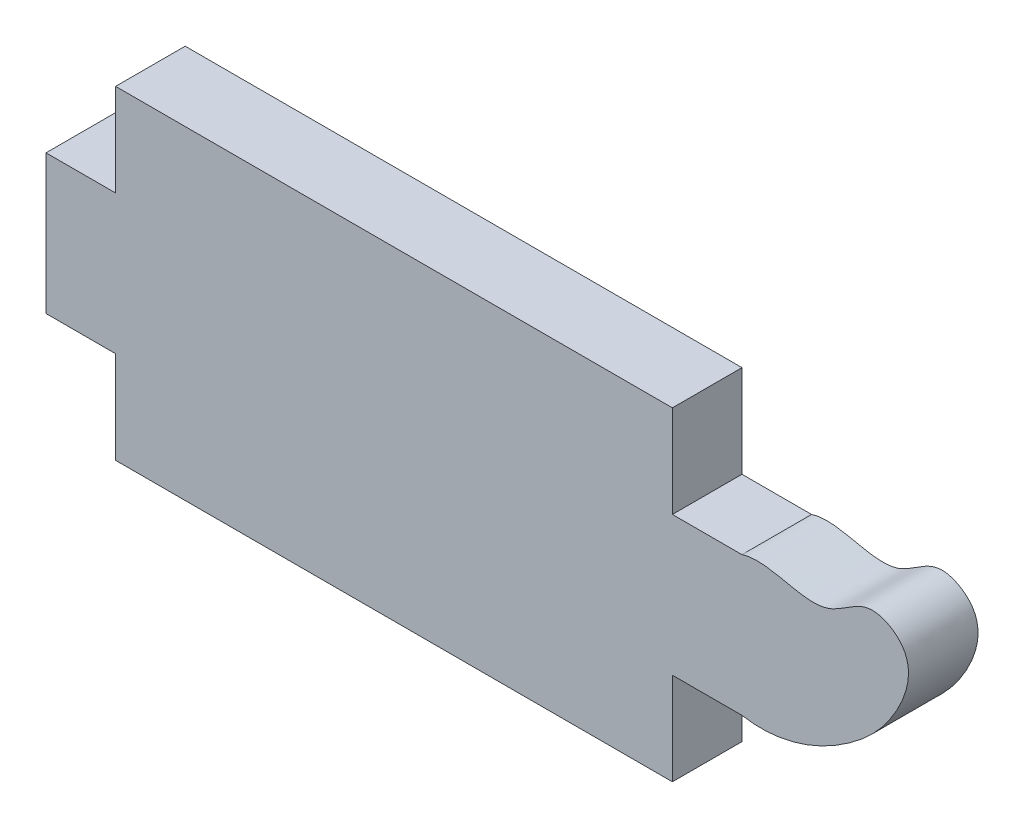
ISO-10303-21;
HEADER;
FILE_DESCRIPTION(('STEP AP214'),'2;1');
FILE_NAME('part.step','',(''),(''),'','','');
FILE_SCHEMA(('AUTOMOTIVE_DESIGN { 1 0 10303 214 1 1 1 1 }'));
ENDSEC;
DATA;
#1=APPLICATION_CONTEXT('core data for automotive mechanical design processes');
#2=APPLICATION_PROTOCOL_DEFINITION('international standard','automotive_design',2000,#1);
#3=PRODUCT_CONTEXT('',#1,'mechanical');
#4=PRODUCT('Part','Part','',(#3));
#5=PRODUCT_RELATED_PRODUCT_CATEGORY('part','',(#4));
#6=PRODUCT_DEFINITION_FORMATION('','',#4);
#7=PRODUCT_DEFINITION_CONTEXT('part definition',#1,'design');
#8=PRODUCT_DEFINITION('design','',#6,#7);
#9=PRODUCT_DEFINITION_SHAPE('','',#8);
#10=(LENGTH_UNIT() NAMED_UNIT(*) SI_UNIT(.MILLI.,.METRE.));
#11=(NAMED_UNIT(*) PLANE_ANGLE_UNIT() SI_UNIT($,.RADIAN.));
#12=(NAMED_UNIT(*) SI_UNIT($,.STERADIAN.) SOLID_ANGLE_UNIT());
#13=UNCERTAINTY_MEASURE_WITH_UNIT(LENGTH_MEASURE(1.E-05),#10,'distance_accuracy_value','');
#14=(GEOMETRIC_REPRESENTATION_CONTEXT(3) GLOBAL_UNCERTAINTY_ASSIGNED_CONTEXT((#13)) GLOBAL_UNIT_ASSIGNED_CONTEXT((#10,
#11,#12)) REPRESENTATION_CONTEXT('',''));
#15=CARTESIAN_POINT('',(0.,0.,0.));
#16=DIRECTION('',(0.,0.,1.));
#17=DIRECTION('',(1.,0.,0.));
#18=AXIS2_PLACEMENT_3D('',#15,#16,#17);
#19=CARTESIAN_POINT('',(0.,48.0131422529701,-3.175));
#20=DIRECTION('',(-1.,0.,0.));
#21=DIRECTION('',(0.,-1.,0.));
#22=AXIS2_PLACEMENT_3D('',#19,#20,#21);
#23=PLANE('',#22);
#24=DIRECTION('',(0.,-1.,0.));
#25=VECTOR('',#24,1.);
#26=CARTESIAN_POINT('',(0.,48.0131422529701,0.));
#27=LINE('',#26,#25);
#28=CARTESIAN_POINT('',(0.,48.0131422529701,0.));
#29=VERTEX_POINT('',#28);
#30=CARTESIAN_POINT('',(0.,43.8003814965513,0.));
#31=VERTEX_POINT('',#30);
#32=EDGE_CURVE('E153',#29,#31,#27,.T.);
#33=ORIENTED_EDGE('',*,*,#32,.T.);
#34=DIRECTION('',(0.,0.,1.));
#35=VECTOR('',#34,1.);
#36=CARTESIAN_POINT('',(0.,43.8003814965513,-3.175));
#37=LINE('',#36,#35);
#38=CARTESIAN_POINT('',(0.,43.8003814965513,-3.175));
#39=VERTEX_POINT('',#38);
#40=EDGE_CURVE('E11',#39,#31,#37,.T.);
#41=ORIENTED_EDGE('',*,*,#40,.F.);
#42=DIRECTION('',(0.,-1.,0.));
#43=VECTOR('',#42,1.);
#44=CARTESIAN_POINT('',(0.,48.0131422529701,-3.175));
#45=LINE('',#44,#43);
#46=CARTESIAN_POINT('',(0.,48.0131422529701,-3.175));
#47=VERTEX_POINT('',#46);
#48=EDGE_CURVE('E98',#47,#39,#45,.T.);
#49=ORIENTED_EDGE('',*,*,#48,.F.);
#50=DIRECTION('',(0.,0.,1.));
#51=VECTOR('',#50,1.);
#52=CARTESIAN_POINT('',(0.,48.0131422529701,-3.175));
#53=LINE('',#52,#51);
#54=EDGE_CURVE('E49',#47,#29,#53,.T.);
#55=ORIENTED_EDGE('',*,*,#54,.T.);
#56=EDGE_LOOP('',(#33,#41,#49,#55));
#57=FACE_BOUND('',#56,.T.);
#58=ADVANCED_FACE('F33',(#57),#23,.F.);
#59=CARTESIAN_POINT('',(3.175,43.8003814965513,-3.175));
#60=DIRECTION('',(0.,1.,0.));
#61=DIRECTION('',(0.,0.,1.));
#62=AXIS2_PLACEMENT_3D('',#59,#60,#61);
#63=PLANE('',#62);
#64=DIRECTION('',(-1.,0.,0.));
#65=VECTOR('',#64,1.);
#66=CARTESIAN_POINT('',(3.175,43.8003814965513,0.));
#67=LINE('',#66,#65);
#68=CARTESIAN_POINT('',(3.175,43.8003814965513,0.));
#69=VERTEX_POINT('',#68);
#70=EDGE_CURVE('E155',#69,#31,#67,.T.);
#71=ORIENTED_EDGE('',*,*,#70,.F.);
#72=DIRECTION('',(0.,0.,1.));
#73=VECTOR('',#72,1.);
#74=CARTESIAN_POINT('',(3.175,43.8003814965513,-3.175));
#75=LINE('',#74,#73);
#76=CARTESIAN_POINT('',(3.175,43.8003814965513,-3.175));
#77=VERTEX_POINT('',#76);
#78=EDGE_CURVE('E41',#77,#69,#75,.T.);
#79=ORIENTED_EDGE('',*,*,#78,.F.);
#80=DIRECTION('',(-1.,0.,0.));
#81=VECTOR('',#80,1.);
#82=CARTESIAN_POINT('',(3.175,43.8003814965513,-3.175));
#83=LINE('',#82,#81);
#84=EDGE_CURVE('E227',#77,#39,#83,.T.);
#85=ORIENTED_EDGE('',*,*,#84,.T.);
#86=ORIENTED_EDGE('',*,*,#40,.T.);
#87=EDGE_LOOP('',(#71,#79,#85,#86));
#88=FACE_BOUND('',#87,.T.);
#89=ADVANCED_FACE('F212',(#88),#63,.T.);
#90=CARTESIAN_POINT('',(3.175,37.4503814965513,-3.175));
#91=CARTESIAN_POINT('',(5.02206388862919,37.1184558025095,-3.175));
#92=CARTESIAN_POINT('',(7.75151141607924,38.2602554304477,-3.175));
#93=CARTESIAN_POINT('',(10.2327629725713,40.7568330619822,-3.175));
#94=CARTESIAN_POINT('',(11.3200461760138,43.626059772161,-3.175));
#95=CARTESIAN_POINT('',(8.82372759272067,45.0463901926915,-3.175));
#96=CARTESIAN_POINT('',(6.7278942310241,42.6783956586535,-3.175));
#97=CARTESIAN_POINT('',(4.43155314018471,44.2179384868482,-3.175));
#98=CARTESIAN_POINT('',(3.175,43.8003814965513,-3.175));
#99=B_SPLINE_CURVE_WITH_KNOTS('',3,(#90,#91,#92,#93,#94,#95,#96,#97,#98),.UNSPECIFIED.,.F.,.F.,
(4,1,1,1,1,1,4),(0.,0.293580813989756,0.427451977786502,0.586796469482608,0.673694467473646,
0.788354379045849,1.),.UNSPECIFIED.);
#100=DIRECTION('',(0.,0.,1.));
#101=VECTOR('',#100,1.);
#102=SURFACE_OF_LINEAR_EXTRUSION('',#99,#101);
#103=CARTESIAN_POINT('',(3.175,37.4503814965513,0.));
#104=CARTESIAN_POINT('',(5.02206388862919,37.1184558025095,0.));
#105=CARTESIAN_POINT('',(7.75151141607924,38.2602554304477,0.));
#106=CARTESIAN_POINT('',(10.2327629725713,40.7568330619822,0.));
#107=CARTESIAN_POINT('',(11.3200461760138,43.626059772161,0.));
#108=CARTESIAN_POINT('',(8.82372759272067,45.0463901926915,0.));
#109=CARTESIAN_POINT('',(6.7278942310241,42.6783956586535,0.));
#110=CARTESIAN_POINT('',(4.43155314018471,44.2179384868482,0.));
#111=CARTESIAN_POINT('',(3.175,43.8003814965513,0.));
#112=B_SPLINE_CURVE_WITH_KNOTS('',3,(#103,#104,#105,#106,#107,#108,#109,#110,#111),
.UNSPECIFIED.,.F.,.F.,(4,1,1,1,1,1,4),(0.,0.293580813989756,0.427451977786502,0.586796469482608,
0.673694467473646,0.788354379045849,1.),.UNSPECIFIED.);
#113=CARTESIAN_POINT('',(3.175,37.4503814965513,0.));
#114=VERTEX_POINT('',#113);
#115=EDGE_CURVE('E158',#114,#69,#112,.T.);
#116=ORIENTED_EDGE('',*,*,#115,.F.);
#117=DIRECTION('',(0.,0.,1.));
#118=VECTOR('',#117,1.);
#119=CARTESIAN_POINT('',(3.175,37.4503814965513,-3.175));
#120=LINE('',#119,#118);
#121=CARTESIAN_POINT('',(3.175,37.4503814965513,-3.175));
#122=VERTEX_POINT('',#121);
#123=EDGE_CURVE('E202',#122,#114,#120,.T.);
#124=ORIENTED_EDGE('',*,*,#123,.F.);
#125=EDGE_CURVE('E209',#122,#77,#99,.T.);
#126=ORIENTED_EDGE('',*,*,#125,.T.);
#127=ORIENTED_EDGE('',*,*,#78,.T.);
#128=EDGE_LOOP('',(#116,#124,#126,#127));
#129=FACE_BOUND('',#128,.T.);
#130=ADVANCED_FACE('F207',(#129),#102,.T.);
#131=CARTESIAN_POINT('',(3.175,37.4503814965513,-3.175));
#132=DIRECTION('',(0.,1.,0.));
#133=DIRECTION('',(0.,0.,1.));
#134=AXIS2_PLACEMENT_3D('',#131,#132,#133);
#135=PLANE('',#134);
#136=DIRECTION('',(-1.,0.,0.));
#137=VECTOR('',#136,1.);
#138=CARTESIAN_POINT('',(3.175,37.4503814965513,0.));
#139=LINE('',#138,#137);
#140=CARTESIAN_POINT('',(0.,37.4503814965513,0.));
#141=VERTEX_POINT('',#140);
#142=EDGE_CURVE('E163',#114,#141,#139,.T.);
#143=ORIENTED_EDGE('',*,*,#142,.T.);
#144=DIRECTION('',(0.,0.,1.));
#145=VECTOR('',#144,1.);
#146=CARTESIAN_POINT('',(0.,37.4503814965513,-3.175));
#147=LINE('',#146,#145);
#148=CARTESIAN_POINT('',(0.,37.4503814965513,-3.175));
#149=VERTEX_POINT('',#148);
#150=EDGE_CURVE('E200',#149,#141,#147,.T.);
#151=ORIENTED_EDGE('',*,*,#150,.F.);
#152=DIRECTION('',(-1.,0.,0.));
#153=VECTOR('',#152,1.);
#154=CARTESIAN_POINT('',(3.175,37.4503814965513,-3.175));
#155=LINE('',#154,#153);
#156=EDGE_CURVE('E223',#122,#149,#155,.T.);
#157=ORIENTED_EDGE('',*,*,#156,.F.);
#158=ORIENTED_EDGE('',*,*,#123,.T.);
#159=EDGE_LOOP('',(#143,#151,#157,#158));
#160=FACE_BOUND('',#159,.T.);
#161=ADVANCED_FACE('F220',(#160),#135,.F.);
#162=CARTESIAN_POINT('',(0.,33.2376207401325,-3.175));
#163=DIRECTION('',(1.,0.,0.));
#164=DIRECTION('',(0.,1.,0.));
#165=AXIS2_PLACEMENT_3D('',#162,#163,#164);
#166=PLANE('',#165);
#167=DIRECTION('',(0.,1.,0.));
#168=VECTOR('',#167,1.);
#169=CARTESIAN_POINT('',(0.,33.2376207401325,0.));
#170=LINE('',#169,#168);
#171=CARTESIAN_POINT('',(0.,33.2376207401325,0.));
#172=VERTEX_POINT('',#171);
#173=EDGE_CURVE('E169',#172,#141,#170,.T.);
#174=ORIENTED_EDGE('',*,*,#173,.F.);
#175=DIRECTION('',(0.,0.,1.));
#176=VECTOR('',#175,1.);
#177=CARTESIAN_POINT('',(0.,33.2376207401325,-3.175));
#178=LINE('',#177,#176);
#179=CARTESIAN_POINT('',(0.,33.2376207401325,-3.175));
#180=VERTEX_POINT('',#179);
#181=EDGE_CURVE('E198',#180,#172,#178,.T.);
#182=ORIENTED_EDGE('',*,*,#181,.F.);
#183=DIRECTION('',(0.,1.,0.));
#184=VECTOR('',#183,1.);
#185=CARTESIAN_POINT('',(0.,33.2376207401325,-3.175));
#186=LINE('',#185,#184);
#187=EDGE_CURVE('E225',#180,#149,#186,.T.);
#188=ORIENTED_EDGE('',*,*,#187,.T.);
#189=ORIENTED_EDGE('',*,*,#150,.T.);
#190=EDGE_LOOP('',(#174,#182,#188,#189));
#191=FACE_BOUND('',#190,.T.);
#192=ADVANCED_FACE('F275',(#191),#166,.T.);
#193=CARTESIAN_POINT('',(0.,33.2376207401325,-3.175));
#194=DIRECTION('',(0.,1.,0.));
#195=DIRECTION('',(0.,0.,1.));
#196=AXIS2_PLACEMENT_3D('',#193,#194,#195);
#197=PLANE('',#196);
#198=DIRECTION('',(-1.,0.,0.));
#199=VECTOR('',#198,1.);
#200=CARTESIAN_POINT('',(0.,33.2376207401325,0.));
#201=LINE('',#200,#199);
#202=CARTESIAN_POINT('',(-25.4,33.2376207401325,0.));
#203=VERTEX_POINT('',#202);
#204=EDGE_CURVE('E172',#172,#203,#201,.T.);
#205=ORIENTED_EDGE('',*,*,#204,.T.);
#206=DIRECTION('',(0.,0.,1.));
#207=VECTOR('',#206,1.);
#208=CARTESIAN_POINT('',(-25.4,33.2376207401325,-3.175));
#209=LINE('',#208,#207);
#210=CARTESIAN_POINT('',(-25.4,33.2376207401325,-3.175));
#211=VERTEX_POINT('',#210);
#212=EDGE_CURVE('E195',#211,#203,#209,.T.);
#213=ORIENTED_EDGE('',*,*,#212,.F.);
#214=DIRECTION('',(-1.,0.,0.));
#215=VECTOR('',#214,1.);
#216=CARTESIAN_POINT('',(0.,33.2376207401325,-3.175));
#217=LINE('',#216,#215);
#218=EDGE_CURVE('E283',#180,#211,#217,.T.);
#219=ORIENTED_EDGE('',*,*,#218,.F.);
#220=ORIENTED_EDGE('',*,*,#181,.T.);
#221=EDGE_LOOP('',(#205,#213,#219,#220));
#222=FACE_BOUND('',#221,.T.);
#223=ADVANCED_FACE('F272',(#222),#197,.F.);
#224=CARTESIAN_POINT('',(-25.4,33.2376207401325,-3.175));
#225=DIRECTION('',(1.,0.,0.));
#226=DIRECTION('',(0.,0.,-1.));
#227=AXIS2_PLACEMENT_3D('',#224,#225,#226);
#228=PLANE('',#227);
#229=DIRECTION('',(0.,1.,0.));
#230=VECTOR('',#229,1.);
#231=CARTESIAN_POINT('',(-25.4,33.2376207401325,0.));
#232=LINE('',#231,#230);
#233=CARTESIAN_POINT('',(-25.4,37.4503814965513,0.));
#234=VERTEX_POINT('',#233);
#235=EDGE_CURVE('E174',#203,#234,#232,.T.);
#236=ORIENTED_EDGE('',*,*,#235,.T.);
#237=DIRECTION('',(0.,0.,1.));
#238=VECTOR('',#237,1.);
#239=CARTESIAN_POINT('',(-25.4,37.4503814965513,-3.175));
#240=LINE('',#239,#238);
#241=CARTESIAN_POINT('',(-25.4,37.4503814965513,-3.175));
#242=VERTEX_POINT('',#241);
#243=EDGE_CURVE('E193',#242,#234,#240,.T.);
#244=ORIENTED_EDGE('',*,*,#243,.F.);
#245=DIRECTION('',(0.,1.,0.));
#246=VECTOR('',#245,1.);
#247=CARTESIAN_POINT('',(-25.4,33.2376207401325,-3.175));
#248=LINE('',#247,#246);
#249=EDGE_CURVE('E284',#211,#242,#248,.T.);
#250=ORIENTED_EDGE('',*,*,#249,.F.);
#251=ORIENTED_EDGE('',*,*,#212,.T.);
#252=EDGE_LOOP('',(#236,#244,#250,#251));
#253=FACE_BOUND('',#252,.T.);
#254=ADVANCED_FACE('F268',(#253),#228,.F.);
#255=CARTESIAN_POINT('',(-28.575,37.4503814965513,-3.175));
#256=DIRECTION('',(0.,-1.,0.));
#257=DIRECTION('',(0.,0.,-1.));
#258=AXIS2_PLACEMENT_3D('',#255,#256,#257);
#259=PLANE('',#258);
#260=DIRECTION('',(1.,0.,0.));
#261=VECTOR('',#260,1.);
#262=CARTESIAN_POINT('',(-28.575,37.4503814965513,0.));
#263=LINE('',#262,#261);
#264=CARTESIAN_POINT('',(-28.575,37.4503814965513,0.));
#265=VERTEX_POINT('',#264);
#266=EDGE_CURVE('E177',#265,#234,#263,.T.);
#267=ORIENTED_EDGE('',*,*,#266,.F.);
#268=DIRECTION('',(0.,0.,1.));
#269=VECTOR('',#268,1.);
#270=CARTESIAN_POINT('',(-28.575,37.4503814965513,-3.175));
#271=LINE('',#270,#269);
#272=CARTESIAN_POINT('',(-28.575,37.4503814965513,-3.175));
#273=VERTEX_POINT('',#272);
#274=EDGE_CURVE('E191',#273,#265,#271,.T.);
#275=ORIENTED_EDGE('',*,*,#274,.F.);
#276=DIRECTION('',(1.,0.,0.));
#277=VECTOR('',#276,1.);
#278=CARTESIAN_POINT('',(-28.575,37.4503814965513,-3.175));
#279=LINE('',#278,#277);
#280=EDGE_CURVE('E288',#273,#242,#279,.T.);
#281=ORIENTED_EDGE('',*,*,#280,.T.);
#282=ORIENTED_EDGE('',*,*,#243,.T.);
#283=EDGE_LOOP('',(#267,#275,#281,#282));
#284=FACE_BOUND('',#283,.T.);
#285=ADVANCED_FACE('F264',(#284),#259,.T.);
#286=CARTESIAN_POINT('',(-28.575,37.4503814965513,-3.175));
#287=DIRECTION('',(1.,0.,0.));
#288=DIRECTION('',(0.,1.,0.));
#289=AXIS2_PLACEMENT_3D('',#286,#287,#288);
#290=PLANE('',#289);
#291=DIRECTION('',(0.,1.,0.));
#292=VECTOR('',#291,1.);
#293=CARTESIAN_POINT('',(-28.575,37.4503814965513,0.));
#294=LINE('',#293,#292);
#295=CARTESIAN_POINT('',(-28.575,43.8003814965513,0.));
#296=VERTEX_POINT('',#295);
#297=EDGE_CURVE('E180',#265,#296,#294,.T.);
#298=ORIENTED_EDGE('',*,*,#297,.T.);
#299=DIRECTION('',(0.,0.,1.));
#300=VECTOR('',#299,1.);
#301=CARTESIAN_POINT('',(-28.575,43.8003814965513,-3.175));
#302=LINE('',#301,#300);
#303=CARTESIAN_POINT('',(-28.575,43.8003814965513,-3.175));
#304=VERTEX_POINT('',#303);
#305=EDGE_CURVE('E145',#304,#296,#302,.T.);
#306=ORIENTED_EDGE('',*,*,#305,.F.);
#307=DIRECTION('',(0.,1.,0.));
#308=VECTOR('',#307,1.);
#309=CARTESIAN_POINT('',(-28.575,37.4503814965513,-3.175));
#310=LINE('',#309,#308);
#311=EDGE_CURVE('E133',#273,#304,#310,.T.);
#312=ORIENTED_EDGE('',*,*,#311,.F.);
#313=ORIENTED_EDGE('',*,*,#274,.T.);
#314=EDGE_LOOP('',(#298,#306,#312,#313));
#315=FACE_BOUND('',#314,.T.);
#316=ADVANCED_FACE('F261',(#315),#290,.F.);
#317=CARTESIAN_POINT('',(-28.575,43.8003814965513,-3.175));
#318=DIRECTION('',(0.,-1.,0.));
#319=DIRECTION('',(0.,0.,-1.));
#320=AXIS2_PLACEMENT_3D('',#317,#318,#319);
#321=PLANE('',#320);
#322=DIRECTION('',(1.,0.,0.));
#323=VECTOR('',#322,1.);
#324=CARTESIAN_POINT('',(-28.575,43.8003814965513,0.));
#325=LINE('',#324,#323);
#326=CARTESIAN_POINT('',(-25.4,43.8003814965513,0.));
#327=VERTEX_POINT('',#326);
#328=EDGE_CURVE('E142',#296,#327,#325,.T.);
#329=ORIENTED_EDGE('',*,*,#328,.T.);
#330=DIRECTION('',(0.,0.,1.));
#331=VECTOR('',#330,1.);
#332=CARTESIAN_POINT('',(-25.4,43.8003814965513,-3.175));
#333=LINE('',#332,#331);
#334=CARTESIAN_POINT('',(-25.4,43.8003814965513,-3.175));
#335=VERTEX_POINT('',#334);
#336=EDGE_CURVE('E139',#335,#327,#333,.T.);
#337=ORIENTED_EDGE('',*,*,#336,.F.);
#338=DIRECTION('',(1.,0.,0.));
#339=VECTOR('',#338,1.);
#340=CARTESIAN_POINT('',(-28.575,43.8003814965513,-3.175));
#341=LINE('',#340,#339);
#342=EDGE_CURVE('E126',#304,#335,#341,.T.);
#343=ORIENTED_EDGE('',*,*,#342,.F.);
#344=ORIENTED_EDGE('',*,*,#305,.T.);
#345=EDGE_LOOP('',(#329,#337,#343,#344));
#346=FACE_BOUND('',#345,.T.);
#347=ADVANCED_FACE('F140',(#346),#321,.F.);
#348=CARTESIAN_POINT('',(-25.4,48.0131422529701,-3.175));
#349=DIRECTION('',(-1.,0.,0.));
#350=DIRECTION('',(0.,-1.,0.));
#351=AXIS2_PLACEMENT_3D('',#348,#349,#350);
#352=PLANE('',#351);
#353=DIRECTION('',(0.,-1.,0.));
#354=VECTOR('',#353,1.);
#355=CARTESIAN_POINT('',(-25.4,48.0131422529701,0.));
#356=LINE('',#355,#354);
#357=CARTESIAN_POINT('',(-25.4,48.0131422529701,0.));
#358=VERTEX_POINT('',#357);
#359=EDGE_CURVE('E183',#358,#327,#356,.T.);
#360=ORIENTED_EDGE('',*,*,#359,.F.);
#361=DIRECTION('',(0.,0.,1.));
#362=VECTOR('',#361,1.);
#363=CARTESIAN_POINT('',(-25.4,48.0131422529701,-3.175));
#364=LINE('',#363,#362);
#365=CARTESIAN_POINT('',(-25.4,48.0131422529701,-3.175));
#366=VERTEX_POINT('',#365);
#367=EDGE_CURVE('E86',#366,#358,#364,.T.);
#368=ORIENTED_EDGE('',*,*,#367,.F.);
#369=DIRECTION('',(0.,-1.,0.));
#370=VECTOR('',#369,1.);
#371=CARTESIAN_POINT('',(-25.4,48.0131422529701,-3.175));
#372=LINE('',#371,#370);
#373=EDGE_CURVE('E130',#366,#335,#372,.T.);
#374=ORIENTED_EDGE('',*,*,#373,.T.);
#375=ORIENTED_EDGE('',*,*,#336,.T.);
#376=EDGE_LOOP('',(#360,#368,#374,#375));
#377=FACE_BOUND('',#376,.T.);
#378=ADVANCED_FACE('F147',(#377),#352,.T.);
#379=CARTESIAN_POINT('',(0.,48.0131422529701,-3.175));
#380=DIRECTION('',(0.,1.,0.));
#381=DIRECTION('',(0.,0.,1.));
#382=AXIS2_PLACEMENT_3D('',#379,#380,#381);
#383=PLANE('',#382);
#384=DIRECTION('',(-1.,0.,0.));
#385=VECTOR('',#384,1.);
#386=CARTESIAN_POINT('',(0.,48.0131422529701,0.));
#387=LINE('',#386,#385);
#388=EDGE_CURVE('E185',#29,#358,#387,.T.);
#389=ORIENTED_EDGE('',*,*,#388,.F.);
#390=ORIENTED_EDGE('',*,*,#54,.F.);
#391=DIRECTION('',(-1.,0.,0.));
#392=VECTOR('',#391,1.);
#393=CARTESIAN_POINT('',(0.,48.0131422529701,-3.175));
#394=LINE('',#393,#392);
#395=EDGE_CURVE('E148',#47,#366,#394,.T.);
#396=ORIENTED_EDGE('',*,*,#395,.T.);
#397=ORIENTED_EDGE('',*,*,#367,.T.);
#398=EDGE_LOOP('',(#389,#390,#396,#397));
#399=FACE_BOUND('',#398,.T.);
#400=ADVANCED_FACE('F248',(#399),#383,.T.);
#401=CARTESIAN_POINT('',(10.6681578444962,42.2183418213747,-3.175));
#402=DIRECTION('',(0.,0.,-1.));
#403=DIRECTION('',(-1.,0.,0.));
#404=AXIS2_PLACEMENT_3D('',#401,#402,#403);
#405=PLANE('',#404);
#406=ORIENTED_EDGE('',*,*,#48,.T.);
#407=ORIENTED_EDGE('',*,*,#84,.F.);
#408=ORIENTED_EDGE('',*,*,#125,.F.);
#409=ORIENTED_EDGE('',*,*,#156,.T.);
#410=ORIENTED_EDGE('',*,*,#187,.F.);
#411=ORIENTED_EDGE('',*,*,#218,.T.);
#412=ORIENTED_EDGE('',*,*,#249,.T.);
#413=ORIENTED_EDGE('',*,*,#280,.F.);
#414=ORIENTED_EDGE('',*,*,#311,.T.);
#415=ORIENTED_EDGE('',*,*,#342,.T.);
#416=ORIENTED_EDGE('',*,*,#373,.F.);
#417=ORIENTED_EDGE('',*,*,#395,.F.);
#418=EDGE_LOOP('',(#406,#407,#408,#409,#410,#411,#412,#413,#414,#415,#416,#417));
#419=FACE_BOUND('',#418,.T.);
#420=ADVANCED_FACE('F128',(#419),#405,.T.);
#421=CARTESIAN_POINT('',(10.6681578444962,42.2183418213747,0.));
#422=DIRECTION('',(0.,0.,-1.));
#423=DIRECTION('',(-1.,0.,0.));
#424=AXIS2_PLACEMENT_3D('',#421,#422,#423);
#425=PLANE('',#424);
#426=ORIENTED_EDGE('',*,*,#32,.F.);
#427=ORIENTED_EDGE('',*,*,#388,.T.);
#428=ORIENTED_EDGE('',*,*,#359,.T.);
#429=ORIENTED_EDGE('',*,*,#328,.F.);
#430=ORIENTED_EDGE('',*,*,#297,.F.);
#431=ORIENTED_EDGE('',*,*,#266,.T.);
#432=ORIENTED_EDGE('',*,*,#235,.F.);
#433=ORIENTED_EDGE('',*,*,#204,.F.);
#434=ORIENTED_EDGE('',*,*,#173,.T.);
#435=ORIENTED_EDGE('',*,*,#142,.F.);
#436=ORIENTED_EDGE('',*,*,#115,.T.);
#437=ORIENTED_EDGE('',*,*,#70,.T.);
#438=EDGE_LOOP('',(#426,#427,#428,#429,#430,#431,#432,#433,#434,#435,#436,#437));
#439=FACE_BOUND('',#438,.T.);
#440=ADVANCED_FACE('F215',(#439),#425,.F.);
#441=CLOSED_SHELL('',(#58,#89,#130,#161,#192,#223,#254,#285,#316,#347,#378,#400,#420,#440));
#442=MANIFOLD_SOLID_BREP('B2',#441);
#443=ADVANCED_BREP_SHAPE_REPRESENTATION('',(#18,#442),#14);
#444=SHAPE_DEFINITION_REPRESENTATION(#9,#443);
ENDSEC;
END-ISO-10303-21;
